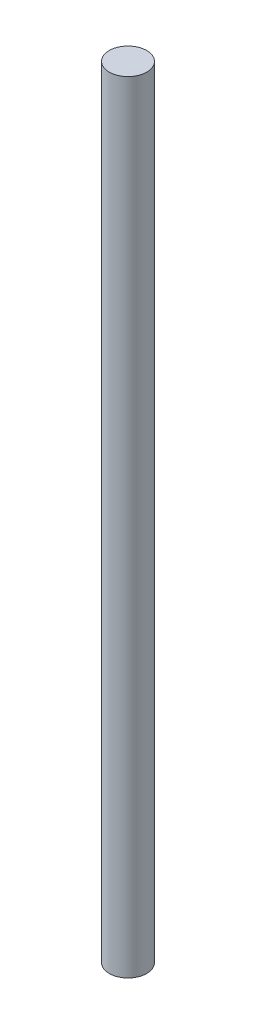
ISO-10303-21;
HEADER;
FILE_DESCRIPTION(('STEP AP214'),'2;1');
FILE_NAME('part.step','',(''),(''),'','','');
FILE_SCHEMA(('AUTOMOTIVE_DESIGN { 1 0 10303 214 1 1 1 1 }'));
ENDSEC;
DATA;
#1=APPLICATION_CONTEXT('core data for automotive mechanical design processes');
#2=APPLICATION_PROTOCOL_DEFINITION('international standard','automotive_design',2000,#1);
#3=PRODUCT_CONTEXT('',#1,'mechanical');
#4=PRODUCT('Part','Part','',(#3));
#5=PRODUCT_RELATED_PRODUCT_CATEGORY('part','',(#4));
#6=PRODUCT_DEFINITION_FORMATION('','',#4);
#7=PRODUCT_DEFINITION_CONTEXT('part definition',#1,'design');
#8=PRODUCT_DEFINITION('design','',#6,#7);
#9=PRODUCT_DEFINITION_SHAPE('','',#8);
#10=(LENGTH_UNIT() NAMED_UNIT(*) SI_UNIT(.MILLI.,.METRE.));
#11=(NAMED_UNIT(*) PLANE_ANGLE_UNIT() SI_UNIT($,.RADIAN.));
#12=(NAMED_UNIT(*) SI_UNIT($,.STERADIAN.) SOLID_ANGLE_UNIT());
#13=UNCERTAINTY_MEASURE_WITH_UNIT(LENGTH_MEASURE(1.E-05),#10,'distance_accuracy_value','');
#14=(GEOMETRIC_REPRESENTATION_CONTEXT(3) GLOBAL_UNCERTAINTY_ASSIGNED_CONTEXT((#13)) GLOBAL_UNIT_ASSIGNED_CONTEXT((#10,
#11,#12)) REPRESENTATION_CONTEXT('',''));
#15=CARTESIAN_POINT('',(0.,0.,0.));
#16=DIRECTION('',(0.,0.,1.));
#17=DIRECTION('',(1.,0.,0.));
#18=AXIS2_PLACEMENT_3D('',#15,#16,#17);
#19=CARTESIAN_POINT('',(0.,125.,0.));
#20=DIRECTION('',(0.,-1.,0.));
#21=DIRECTION('',(0.,0.,-1.));
#22=AXIS2_PLACEMENT_3D('',#19,#20,#21);
#23=CYLINDRICAL_SURFACE('',#22,3.);
#24=CARTESIAN_POINT('',(0.,125.,0.));
#25=DIRECTION('',(0.,1.,0.));
#26=DIRECTION('',(0.,0.,1.));
#27=AXIS2_PLACEMENT_3D('',#24,#25,#26);
#28=CIRCLE('',#27,3.);
#29=CARTESIAN_POINT('',(0.,125.,3.));
#30=VERTEX_POINT('',#29);
#31=EDGE_CURVE('E10',#30,#30,#28,.T.);
#32=ORIENTED_EDGE('',*,*,#31,.F.);
#33=EDGE_LOOP('',(#32));
#34=FACE_BOUND('',#33,.T.);
#35=CARTESIAN_POINT('',(0.,0.,0.));
#36=DIRECTION('',(0.,1.,0.));
#37=DIRECTION('',(0.,0.,1.));
#38=AXIS2_PLACEMENT_3D('',#35,#36,#37);
#39=CIRCLE('',#38,3.);
#40=CARTESIAN_POINT('',(0.,0.,3.));
#41=VERTEX_POINT('',#40);
#42=EDGE_CURVE('E38',#41,#41,#39,.T.);
#43=ORIENTED_EDGE('',*,*,#42,.T.);
#44=EDGE_LOOP('',(#43));
#45=FACE_BOUND('',#44,.T.);
#46=ADVANCED_FACE('F35',(#34,#45),#23,.T.);
#47=CARTESIAN_POINT('',(0.,125.,0.));
#48=DIRECTION('',(0.,1.,0.));
#49=DIRECTION('',(0.,0.,1.));
#50=AXIS2_PLACEMENT_3D('',#47,#48,#49);
#51=PLANE('',#50);
#52=ORIENTED_EDGE('',*,*,#31,.T.);
#53=EDGE_LOOP('',(#52));
#54=FACE_BOUND('',#53,.T.);
#55=ADVANCED_FACE('F50',(#54),#51,.T.);
#56=CARTESIAN_POINT('',(0.,0.,0.));
#57=DIRECTION('',(0.,1.,0.));
#58=DIRECTION('',(0.,0.,1.));
#59=AXIS2_PLACEMENT_3D('',#56,#57,#58);
#60=PLANE('',#59);
#61=ORIENTED_EDGE('',*,*,#42,.F.);
#62=EDGE_LOOP('',(#61));
#63=FACE_BOUND('',#62,.T.);
#64=ADVANCED_FACE('F48',(#63),#60,.F.);
#65=CLOSED_SHELL('',(#46,#55,#64));
#66=MANIFOLD_SOLID_BREP('B2',#65);
#67=ADVANCED_BREP_SHAPE_REPRESENTATION('',(#18,#66),#14);
#68=SHAPE_DEFINITION_REPRESENTATION(#9,#67);
ENDSEC;
END-ISO-10303-21;
